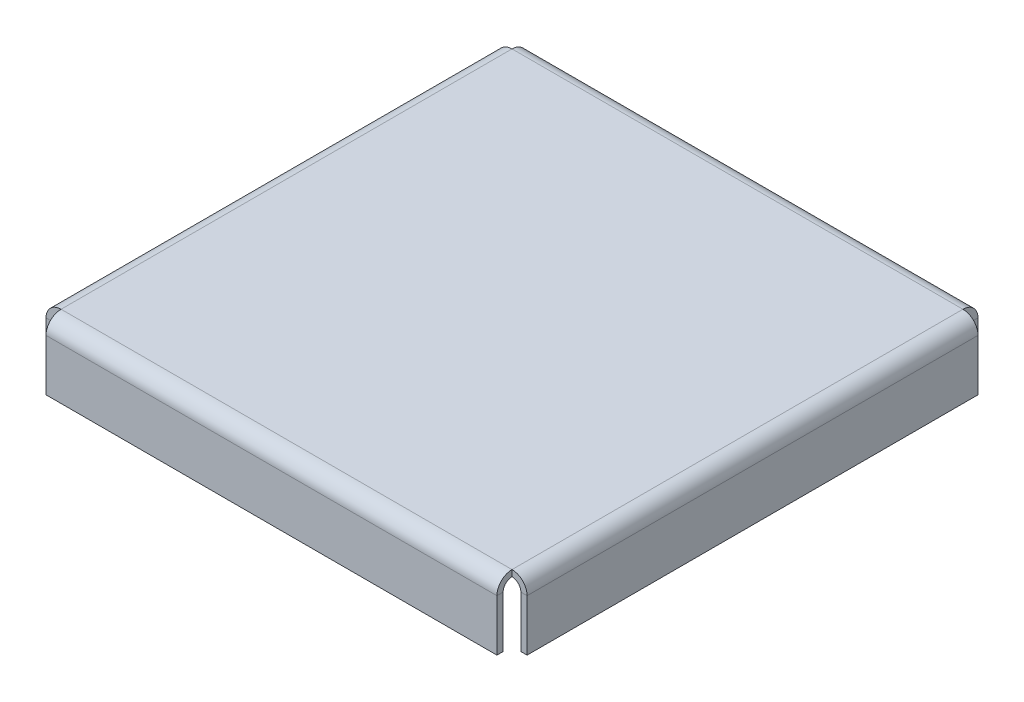
ISO-10303-21;
HEADER;
FILE_DESCRIPTION(('STEP AP214'),'2;1');
FILE_NAME('part.step','',(''),(''),'','','');
FILE_SCHEMA(('AUTOMOTIVE_DESIGN { 1 0 10303 214 1 1 1 1 }'));
ENDSEC;
DATA;
#1=APPLICATION_CONTEXT('core data for automotive mechanical design processes');
#2=APPLICATION_PROTOCOL_DEFINITION('international standard','automotive_design',2000,#1);
#3=PRODUCT_CONTEXT('',#1,'mechanical');
#4=PRODUCT('Part','Part','',(#3));
#5=PRODUCT_RELATED_PRODUCT_CATEGORY('part','',(#4));
#6=PRODUCT_DEFINITION_FORMATION('','',#4);
#7=PRODUCT_DEFINITION_CONTEXT('part definition',#1,'design');
#8=PRODUCT_DEFINITION('design','',#6,#7);
#9=PRODUCT_DEFINITION_SHAPE('','',#8);
#10=(LENGTH_UNIT() NAMED_UNIT(*) SI_UNIT(.MILLI.,.METRE.));
#11=(NAMED_UNIT(*) PLANE_ANGLE_UNIT() SI_UNIT($,.RADIAN.));
#12=(NAMED_UNIT(*) SI_UNIT($,.STERADIAN.) SOLID_ANGLE_UNIT());
#13=UNCERTAINTY_MEASURE_WITH_UNIT(LENGTH_MEASURE(1.E-05),#10,'distance_accuracy_value','');
#14=(GEOMETRIC_REPRESENTATION_CONTEXT(3) GLOBAL_UNCERTAINTY_ASSIGNED_CONTEXT((#13)) GLOBAL_UNIT_ASSIGNED_CONTEXT((#10,
#11,#12)) REPRESENTATION_CONTEXT('',''));
#15=CARTESIAN_POINT('',(0.,0.,0.));
#16=DIRECTION('',(0.,0.,1.));
#17=DIRECTION('',(1.,0.,0.));
#18=AXIS2_PLACEMENT_3D('',#15,#16,#17);
#19=CARTESIAN_POINT('',(0.,-0.7,0.));
#20=DIRECTION('',(0.,-1.,0.));
#21=DIRECTION('',(0.,0.,-1.));
#22=AXIS2_PLACEMENT_3D('',#19,#20,#21);
#23=PLANE('',#22);
#24=DIRECTION('',(0.,0.,-1.));
#25=VECTOR('',#24,1.);
#26=CARTESIAN_POINT('',(25.4,-0.7,25.4));
#27=LINE('',#26,#25);
#28=CARTESIAN_POINT('',(25.4,-0.699999999999996,25.4));
#29=VERTEX_POINT('',#28);
#30=CARTESIAN_POINT('',(25.4,-0.700000000000002,-25.4));
#31=VERTEX_POINT('',#30);
#32=EDGE_CURVE('E453',#29,#31,#27,.T.);
#33=ORIENTED_EDGE('',*,*,#32,.F.);
#34=DIRECTION('',(1.,0.,0.));
#35=VECTOR('',#34,1.);
#36=CARTESIAN_POINT('',(-25.4,-0.7,25.4));
#37=LINE('',#36,#35);
#38=CARTESIAN_POINT('',(-25.4,-0.699999999999997,25.4));
#39=VERTEX_POINT('',#38);
#40=EDGE_CURVE('E461',#39,#29,#37,.T.);
#41=ORIENTED_EDGE('',*,*,#40,.F.);
#42=DIRECTION('',(0.,0.,1.));
#43=VECTOR('',#42,1.);
#44=CARTESIAN_POINT('',(-25.4,-0.7,25.4));
#45=LINE('',#44,#43);
#46=CARTESIAN_POINT('',(-25.4,-0.700000000000007,-25.4));
#47=VERTEX_POINT('',#46);
#48=EDGE_CURVE('E459',#47,#39,#45,.T.);
#49=ORIENTED_EDGE('',*,*,#48,.F.);
#50=DIRECTION('',(-1.,0.,0.));
#51=VECTOR('',#50,1.);
#52=CARTESIAN_POINT('',(-25.4,-0.7,-25.4));
#53=LINE('',#52,#51);
#54=EDGE_CURVE('E456',#31,#47,#53,.T.);
#55=ORIENTED_EDGE('',*,*,#54,.F.);
#56=EDGE_LOOP('',(#33,#41,#49,#55));
#57=FACE_BOUND('',#56,.T.);
#58=ADVANCED_FACE('F117',(#57),#23,.T.);
#59=CARTESIAN_POINT('',(0.,0.,0.));
#60=DIRECTION('',(0.,-1.,0.));
#61=DIRECTION('',(0.,0.,-1.));
#62=AXIS2_PLACEMENT_3D('',#59,#60,#61);
#63=PLANE('',#62);
#64=DIRECTION('',(0.,0.,-1.));
#65=VECTOR('',#64,1.);
#66=CARTESIAN_POINT('',(25.4,0.,25.4));
#67=LINE('',#66,#65);
#68=CARTESIAN_POINT('',(25.4,0.,25.4));
#69=VERTEX_POINT('',#68);
#70=CARTESIAN_POINT('',(25.4,0.,-25.4));
#71=VERTEX_POINT('',#70);
#72=EDGE_CURVE('E447',#69,#71,#67,.T.);
#73=ORIENTED_EDGE('',*,*,#72,.T.);
#74=DIRECTION('',(-1.,0.,0.));
#75=VECTOR('',#74,1.);
#76=CARTESIAN_POINT('',(-25.4,0.,-25.4));
#77=LINE('',#76,#75);
#78=CARTESIAN_POINT('',(-25.4,0.,-25.4));
#79=VERTEX_POINT('',#78);
#80=EDGE_CURVE('E277',#71,#79,#77,.T.);
#81=ORIENTED_EDGE('',*,*,#80,.T.);
#82=DIRECTION('',(0.,0.,1.));
#83=VECTOR('',#82,1.);
#84=CARTESIAN_POINT('',(-25.4,0.,25.4));
#85=LINE('',#84,#83);
#86=CARTESIAN_POINT('',(-25.4,0.,25.4));
#87=VERTEX_POINT('',#86);
#88=EDGE_CURVE('E466',#79,#87,#85,.T.);
#89=ORIENTED_EDGE('',*,*,#88,.T.);
#90=DIRECTION('',(1.,0.,0.));
#91=VECTOR('',#90,1.);
#92=CARTESIAN_POINT('',(-25.4,0.,25.4));
#93=LINE('',#92,#91);
#94=EDGE_CURVE('E457',#87,#69,#93,.T.);
#95=ORIENTED_EDGE('',*,*,#94,.T.);
#96=EDGE_LOOP('',(#73,#81,#89,#95));
#97=FACE_BOUND('',#96,.T.);
#98=ADVANCED_FACE('F119',(#97),#63,.F.);
#99=CARTESIAN_POINT('',(25.4,-1.7,-25.4));
#100=DIRECTION('',(0.,0.,-1.));
#101=DIRECTION('',(-1.,0.,0.));
#102=AXIS2_PLACEMENT_3D('',#99,#100,#101);
#103=PLANE('',#102);
#104=DIRECTION('',(-1.,0.,0.));
#105=VECTOR('',#104,1.);
#106=CARTESIAN_POINT('',(27.1,-1.69999999999999,-25.4));
#107=LINE('',#106,#105);
#108=CARTESIAN_POINT('',(26.4,-1.7,-25.4));
#109=VERTEX_POINT('',#108);
#110=CARTESIAN_POINT('',(27.1,-1.69999999999999,-25.4));
#111=VERTEX_POINT('',#110);
#112=EDGE_CURVE('E147',#109,#111,#107,.F.);
#113=ORIENTED_EDGE('',*,*,#112,.F.);
#114=CARTESIAN_POINT('',(25.4,-1.7,-25.4));
#115=DIRECTION('',(0.,0.,1.));
#116=DIRECTION('',(1.,0.,0.));
#117=AXIS2_PLACEMENT_3D('',#114,#115,#116);
#118=CIRCLE('',#117,1.);
#119=EDGE_CURVE('E449',#31,#109,#118,.F.);
#120=ORIENTED_EDGE('',*,*,#119,.F.);
#121=DIRECTION('',(0.,1.,0.));
#122=VECTOR('',#121,1.);
#123=CARTESIAN_POINT('',(25.4,-0.7,-25.4));
#124=LINE('',#123,#122);
#125=EDGE_CURVE('E121',#31,#71,#124,.T.);
#126=ORIENTED_EDGE('',*,*,#125,.T.);
#127=CARTESIAN_POINT('',(25.4,-1.7,-25.4));
#128=DIRECTION('',(0.,0.,1.));
#129=DIRECTION('',(1.,0.,0.));
#130=AXIS2_PLACEMENT_3D('',#127,#128,#129);
#131=CIRCLE('',#130,1.7);
#132=EDGE_CURVE('E445',#71,#111,#131,.F.);
#133=ORIENTED_EDGE('',*,*,#132,.T.);
#134=EDGE_LOOP('',(#113,#120,#126,#133));
#135=FACE_BOUND('',#134,.T.);
#136=ADVANCED_FACE('F474',(#135),#103,.T.);
#137=CARTESIAN_POINT('',(25.4,-1.7,25.4));
#138=DIRECTION('',(0.,0.,-1.));
#139=DIRECTION('',(-1.,0.,0.));
#140=AXIS2_PLACEMENT_3D('',#137,#138,#139);
#141=PLANE('',#140);
#142=CARTESIAN_POINT('',(25.4,-1.7,25.4));
#143=DIRECTION('',(0.,0.,1.));
#144=DIRECTION('',(1.,0.,0.));
#145=AXIS2_PLACEMENT_3D('',#142,#143,#144);
#146=CIRCLE('',#145,1.);
#147=CARTESIAN_POINT('',(26.4,-1.7,25.4));
#148=VERTEX_POINT('',#147);
#149=EDGE_CURVE('E422',#148,#29,#146,.T.);
#150=ORIENTED_EDGE('',*,*,#149,.F.);
#151=DIRECTION('',(-1.,0.,0.));
#152=VECTOR('',#151,1.);
#153=CARTESIAN_POINT('',(26.4,-1.7,25.4));
#154=LINE('',#153,#152);
#155=CARTESIAN_POINT('',(27.1,-1.69999999999999,25.4));
#156=VERTEX_POINT('',#155);
#157=EDGE_CURVE('E440',#148,#156,#154,.F.);
#158=ORIENTED_EDGE('',*,*,#157,.T.);
#159=CARTESIAN_POINT('',(25.4,-1.7,25.4));
#160=DIRECTION('',(0.,0.,1.));
#161=DIRECTION('',(1.,0.,0.));
#162=AXIS2_PLACEMENT_3D('',#159,#160,#161);
#163=CIRCLE('',#162,1.7);
#164=EDGE_CURVE('E175',#156,#69,#163,.T.);
#165=ORIENTED_EDGE('',*,*,#164,.T.);
#166=DIRECTION('',(0.,1.,0.));
#167=VECTOR('',#166,1.);
#168=CARTESIAN_POINT('',(25.4,-0.7,25.4));
#169=LINE('',#168,#167);
#170=EDGE_CURVE('E13',#29,#69,#169,.T.);
#171=ORIENTED_EDGE('',*,*,#170,.F.);
#172=EDGE_LOOP('',(#150,#158,#165,#171));
#173=FACE_BOUND('',#172,.T.);
#174=ADVANCED_FACE('F484',(#173),#141,.F.);
#175=CARTESIAN_POINT('',(25.4,-1.7,25.4));
#176=DIRECTION('',(0.,0.,1.));
#177=DIRECTION('',(1.,0.,0.));
#178=AXIS2_PLACEMENT_3D('',#175,#176,#177);
#179=CYLINDRICAL_SURFACE('',#178,1.7);
#180=ORIENTED_EDGE('',*,*,#72,.F.);
#181=ORIENTED_EDGE('',*,*,#164,.F.);
#182=DIRECTION('',(0.,0.,1.));
#183=VECTOR('',#182,1.);
#184=CARTESIAN_POINT('',(27.1,-1.69999999999999,-25.4));
#185=LINE('',#184,#183);
#186=EDGE_CURVE('E438',#156,#111,#185,.F.);
#187=ORIENTED_EDGE('',*,*,#186,.T.);
#188=ORIENTED_EDGE('',*,*,#132,.F.);
#189=EDGE_LOOP('',(#180,#181,#187,#188));
#190=FACE_BOUND('',#189,.T.);
#191=ADVANCED_FACE('F480',(#190),#179,.T.);
#192=CARTESIAN_POINT('',(25.4,-1.7,25.4));
#193=DIRECTION('',(0.,0.,1.));
#194=DIRECTION('',(1.,0.,0.));
#195=AXIS2_PLACEMENT_3D('',#192,#193,#194);
#196=CYLINDRICAL_SURFACE('',#195,1.);
#197=ORIENTED_EDGE('',*,*,#32,.T.);
#198=ORIENTED_EDGE('',*,*,#119,.T.);
#199=DIRECTION('',(0.,0.,1.));
#200=VECTOR('',#199,1.);
#201=CARTESIAN_POINT('',(26.4,-1.7,-25.4));
#202=LINE('',#201,#200);
#203=EDGE_CURVE('E442',#109,#148,#202,.T.);
#204=ORIENTED_EDGE('',*,*,#203,.T.);
#205=ORIENTED_EDGE('',*,*,#149,.T.);
#206=EDGE_LOOP('',(#197,#198,#204,#205));
#207=FACE_BOUND('',#206,.T.);
#208=ADVANCED_FACE('F504',(#207),#196,.F.);
#209=CARTESIAN_POINT('',(27.1,-7.5,25.4));
#210=DIRECTION('',(0.,0.,-1.));
#211=DIRECTION('',(-1.,0.,0.));
#212=AXIS2_PLACEMENT_3D('',#209,#210,#211);
#213=PLANE('',#212);
#214=ORIENTED_EDGE('',*,*,#157,.F.);
#215=DIRECTION('',(0.,1.,0.));
#216=VECTOR('',#215,1.);
#217=CARTESIAN_POINT('',(26.4,-7.5,25.4));
#218=LINE('',#217,#216);
#219=CARTESIAN_POINT('',(26.4,-7.5,25.4));
#220=VERTEX_POINT('',#219);
#221=EDGE_CURVE('E436',#148,#220,#218,.F.);
#222=ORIENTED_EDGE('',*,*,#221,.T.);
#223=DIRECTION('',(-1.,0.,0.));
#224=VECTOR('',#223,1.);
#225=CARTESIAN_POINT('',(27.1,-7.5,25.4));
#226=LINE('',#225,#224);
#227=CARTESIAN_POINT('',(27.1,-7.5,25.4));
#228=VERTEX_POINT('',#227);
#229=EDGE_CURVE('E419',#228,#220,#226,.T.);
#230=ORIENTED_EDGE('',*,*,#229,.F.);
#231=DIRECTION('',(0.,-1.,0.));
#232=VECTOR('',#231,1.);
#233=CARTESIAN_POINT('',(27.1,0.,25.4));
#234=LINE('',#233,#232);
#235=EDGE_CURVE('E429',#156,#228,#234,.T.);
#236=ORIENTED_EDGE('',*,*,#235,.F.);
#237=EDGE_LOOP('',(#214,#222,#230,#236));
#238=FACE_BOUND('',#237,.T.);
#239=ADVANCED_FACE('F493',(#238),#213,.F.);
#240=CARTESIAN_POINT('',(27.1,-0.699999999999998,-25.4));
#241=DIRECTION('',(0.,0.,1.));
#242=DIRECTION('',(1.,0.,0.));
#243=AXIS2_PLACEMENT_3D('',#240,#241,#242);
#244=PLANE('',#243);
#245=ORIENTED_EDGE('',*,*,#112,.T.);
#246=DIRECTION('',(0.,1.,0.));
#247=VECTOR('',#246,1.);
#248=CARTESIAN_POINT('',(27.1,0.,-25.4));
#249=LINE('',#248,#247);
#250=CARTESIAN_POINT('',(27.1,-7.5,-25.4));
#251=VERTEX_POINT('',#250);
#252=EDGE_CURVE('E426',#251,#111,#249,.T.);
#253=ORIENTED_EDGE('',*,*,#252,.F.);
#254=DIRECTION('',(-1.,0.,0.));
#255=VECTOR('',#254,1.);
#256=CARTESIAN_POINT('',(27.1,-7.5,-25.4));
#257=LINE('',#256,#255);
#258=CARTESIAN_POINT('',(26.4,-7.5,-25.4));
#259=VERTEX_POINT('',#258);
#260=EDGE_CURVE('E423',#251,#259,#257,.T.);
#261=ORIENTED_EDGE('',*,*,#260,.T.);
#262=DIRECTION('',(0.,-1.,0.));
#263=VECTOR('',#262,1.);
#264=CARTESIAN_POINT('',(26.4,-0.7,-25.4));
#265=LINE('',#264,#263);
#266=EDGE_CURVE('E431',#259,#109,#265,.F.);
#267=ORIENTED_EDGE('',*,*,#266,.T.);
#268=EDGE_LOOP('',(#245,#253,#261,#267));
#269=FACE_BOUND('',#268,.T.);
#270=ADVANCED_FACE('F499',(#269),#244,.F.);
#271=CARTESIAN_POINT('',(27.1,0.,0.));
#272=DIRECTION('',(-1.,0.,0.));
#273=DIRECTION('',(0.,-1.,0.));
#274=AXIS2_PLACEMENT_3D('',#271,#272,#273);
#275=PLANE('',#274);
#276=ORIENTED_EDGE('',*,*,#186,.F.);
#277=ORIENTED_EDGE('',*,*,#235,.T.);
#278=DIRECTION('',(0.,0.,-1.));
#279=VECTOR('',#278,1.);
#280=CARTESIAN_POINT('',(27.1,-7.5,0.));
#281=LINE('',#280,#279);
#282=EDGE_CURVE('E157',#228,#251,#281,.T.);
#283=ORIENTED_EDGE('',*,*,#282,.T.);
#284=ORIENTED_EDGE('',*,*,#252,.T.);
#285=EDGE_LOOP('',(#276,#277,#283,#284));
#286=FACE_BOUND('',#285,.T.);
#287=ADVANCED_FACE('F490',(#286),#275,.F.);
#288=CARTESIAN_POINT('',(26.4,0.,0.));
#289=DIRECTION('',(-1.,0.,0.));
#290=DIRECTION('',(0.,-1.,0.));
#291=AXIS2_PLACEMENT_3D('',#288,#289,#290);
#292=PLANE('',#291);
#293=ORIENTED_EDGE('',*,*,#221,.F.);
#294=ORIENTED_EDGE('',*,*,#203,.F.);
#295=ORIENTED_EDGE('',*,*,#266,.F.);
#296=DIRECTION('',(0.,0.,1.));
#297=VECTOR('',#296,1.);
#298=CARTESIAN_POINT('',(26.4,-7.5,-25.4));
#299=LINE('',#298,#297);
#300=EDGE_CURVE('E434',#220,#259,#299,.F.);
#301=ORIENTED_EDGE('',*,*,#300,.F.);
#302=EDGE_LOOP('',(#293,#294,#295,#301));
#303=FACE_BOUND('',#302,.T.);
#304=ADVANCED_FACE('F502',(#303),#292,.T.);
#305=CARTESIAN_POINT('',(27.1,-7.5,-25.4));
#306=DIRECTION('',(0.,1.,0.));
#307=DIRECTION('',(-1.,0.,0.));
#308=AXIS2_PLACEMENT_3D('',#305,#306,#307);
#309=PLANE('',#308);
#310=ORIENTED_EDGE('',*,*,#300,.T.);
#311=ORIENTED_EDGE('',*,*,#260,.F.);
#312=ORIENTED_EDGE('',*,*,#282,.F.);
#313=ORIENTED_EDGE('',*,*,#229,.T.);
#314=EDGE_LOOP('',(#310,#311,#312,#313));
#315=FACE_BOUND('',#314,.T.);
#316=ADVANCED_FACE('F496',(#315),#309,.F.);
#317=CARTESIAN_POINT('',(25.4,-1.7,25.4));
#318=DIRECTION('',(1.,0.,0.));
#319=DIRECTION('',(0.,0.,-1.));
#320=AXIS2_PLACEMENT_3D('',#317,#318,#319);
#321=PLANE('',#320);
#322=DIRECTION('',(0.,0.,-1.));
#323=VECTOR('',#322,1.);
#324=CARTESIAN_POINT('',(25.4,-1.7,27.1));
#325=LINE('',#324,#323);
#326=CARTESIAN_POINT('',(25.4,-1.69999999999999,26.4));
#327=VERTEX_POINT('',#326);
#328=CARTESIAN_POINT('',(25.4,-1.69999999999999,27.1));
#329=VERTEX_POINT('',#328);
#330=EDGE_CURVE('E197',#327,#329,#325,.F.);
#331=ORIENTED_EDGE('',*,*,#330,.F.);
#332=CARTESIAN_POINT('',(25.4,-1.7,25.4));
#333=DIRECTION('',(-1.,0.,0.));
#334=DIRECTION('',(0.,0.,1.));
#335=AXIS2_PLACEMENT_3D('',#332,#333,#334);
#336=CIRCLE('',#335,1.);
#337=EDGE_CURVE('E415',#29,#327,#336,.F.);
#338=ORIENTED_EDGE('',*,*,#337,.F.);
#339=ORIENTED_EDGE('',*,*,#170,.T.);
#340=CARTESIAN_POINT('',(25.4,-1.7,25.4));
#341=DIRECTION('',(-1.,0.,0.));
#342=DIRECTION('',(0.,0.,1.));
#343=AXIS2_PLACEMENT_3D('',#340,#341,#342);
#344=CIRCLE('',#343,1.7);
#345=EDGE_CURVE('E136',#69,#329,#344,.F.);
#346=ORIENTED_EDGE('',*,*,#345,.T.);
#347=EDGE_LOOP('',(#331,#338,#339,#346));
#348=FACE_BOUND('',#347,.T.);
#349=ADVANCED_FACE('F562',(#348),#321,.T.);
#350=CARTESIAN_POINT('',(-25.4,-1.7,25.4));
#351=DIRECTION('',(1.,0.,0.));
#352=DIRECTION('',(0.,0.,-1.));
#353=AXIS2_PLACEMENT_3D('',#350,#351,#352);
#354=PLANE('',#353);
#355=CARTESIAN_POINT('',(-25.4,-1.7,25.4));
#356=DIRECTION('',(-1.,0.,0.));
#357=DIRECTION('',(0.,0.,1.));
#358=AXIS2_PLACEMENT_3D('',#355,#356,#357);
#359=CIRCLE('',#358,1.);
#360=CARTESIAN_POINT('',(-25.4,-1.69999999999999,26.4));
#361=VERTEX_POINT('',#360);
#362=EDGE_CURVE('E390',#361,#39,#359,.T.);
#363=ORIENTED_EDGE('',*,*,#362,.F.);
#364=DIRECTION('',(0.,0.,-1.));
#365=VECTOR('',#364,1.);
#366=CARTESIAN_POINT('',(-25.4,-1.7,26.4));
#367=LINE('',#366,#365);
#368=CARTESIAN_POINT('',(-25.4,-1.7,27.1));
#369=VERTEX_POINT('',#368);
#370=EDGE_CURVE('E408',#361,#369,#367,.F.);
#371=ORIENTED_EDGE('',*,*,#370,.T.);
#372=CARTESIAN_POINT('',(-25.4,-1.7,25.4));
#373=DIRECTION('',(-1.,0.,0.));
#374=DIRECTION('',(0.,0.,1.));
#375=AXIS2_PLACEMENT_3D('',#372,#373,#374);
#376=CIRCLE('',#375,1.7);
#377=EDGE_CURVE('E223',#369,#87,#376,.T.);
#378=ORIENTED_EDGE('',*,*,#377,.T.);
#379=DIRECTION('',(0.,1.,0.));
#380=VECTOR('',#379,1.);
#381=CARTESIAN_POINT('',(-25.4,-0.7,25.4));
#382=LINE('',#381,#380);
#383=EDGE_CURVE('E127',#39,#87,#382,.T.);
#384=ORIENTED_EDGE('',*,*,#383,.F.);
#385=EDGE_LOOP('',(#363,#371,#378,#384));
#386=FACE_BOUND('',#385,.T.);
#387=ADVANCED_FACE('F541',(#386),#354,.F.);
#388=CARTESIAN_POINT('',(-25.4,-1.7,25.4));
#389=DIRECTION('',(-1.,0.,0.));
#390=DIRECTION('',(0.,0.,1.));
#391=AXIS2_PLACEMENT_3D('',#388,#389,#390);
#392=CYLINDRICAL_SURFACE('',#391,1.7);
#393=ORIENTED_EDGE('',*,*,#94,.F.);
#394=ORIENTED_EDGE('',*,*,#377,.F.);
#395=DIRECTION('',(-1.,0.,0.));
#396=VECTOR('',#395,1.);
#397=CARTESIAN_POINT('',(25.4,-1.7,27.1));
#398=LINE('',#397,#396);
#399=EDGE_CURVE('E406',#369,#329,#398,.F.);
#400=ORIENTED_EDGE('',*,*,#399,.T.);
#401=ORIENTED_EDGE('',*,*,#345,.F.);
#402=EDGE_LOOP('',(#393,#394,#400,#401));
#403=FACE_BOUND('',#402,.T.);
#404=ADVANCED_FACE('F540',(#403),#392,.T.);
#405=CARTESIAN_POINT('',(-25.4,-1.7,25.4));
#406=DIRECTION('',(-1.,0.,0.));
#407=DIRECTION('',(0.,0.,1.));
#408=AXIS2_PLACEMENT_3D('',#405,#406,#407);
#409=CYLINDRICAL_SURFACE('',#408,1.);
#410=ORIENTED_EDGE('',*,*,#40,.T.);
#411=ORIENTED_EDGE('',*,*,#337,.T.);
#412=DIRECTION('',(-1.,0.,0.));
#413=VECTOR('',#412,1.);
#414=CARTESIAN_POINT('',(25.4,-1.7,26.4));
#415=LINE('',#414,#413);
#416=EDGE_CURVE('E410',#327,#361,#415,.T.);
#417=ORIENTED_EDGE('',*,*,#416,.T.);
#418=ORIENTED_EDGE('',*,*,#362,.T.);
#419=EDGE_LOOP('',(#410,#411,#417,#418));
#420=FACE_BOUND('',#419,.T.);
#421=ADVANCED_FACE('F561',(#420),#409,.F.);
#422=CARTESIAN_POINT('',(-25.4,-7.5,27.1));
#423=DIRECTION('',(1.,0.,0.));
#424=DIRECTION('',(0.,0.,-1.));
#425=AXIS2_PLACEMENT_3D('',#422,#423,#424);
#426=PLANE('',#425);
#427=ORIENTED_EDGE('',*,*,#370,.F.);
#428=DIRECTION('',(0.,1.,0.));
#429=VECTOR('',#428,1.);
#430=CARTESIAN_POINT('',(-25.4,-7.5,26.4));
#431=LINE('',#430,#429);
#432=CARTESIAN_POINT('',(-25.4,-7.5,26.4));
#433=VERTEX_POINT('',#432);
#434=EDGE_CURVE('E404',#361,#433,#431,.F.);
#435=ORIENTED_EDGE('',*,*,#434,.T.);
#436=DIRECTION('',(0.,0.,-1.));
#437=VECTOR('',#436,1.);
#438=CARTESIAN_POINT('',(-25.4,-7.5,27.1));
#439=LINE('',#438,#437);
#440=CARTESIAN_POINT('',(-25.4,-7.5,27.1));
#441=VERTEX_POINT('',#440);
#442=EDGE_CURVE('E387',#441,#433,#439,.T.);
#443=ORIENTED_EDGE('',*,*,#442,.F.);
#444=DIRECTION('',(0.,-1.,0.));
#445=VECTOR('',#444,1.);
#446=CARTESIAN_POINT('',(-25.4,0.,27.1));
#447=LINE('',#446,#445);
#448=EDGE_CURVE('E397',#369,#441,#447,.T.);
#449=ORIENTED_EDGE('',*,*,#448,.F.);
#450=EDGE_LOOP('',(#427,#435,#443,#449));
#451=FACE_BOUND('',#450,.T.);
#452=ADVANCED_FACE('F550',(#451),#426,.F.);
#453=CARTESIAN_POINT('',(25.4,-0.699999999999997,27.1));
#454=DIRECTION('',(-1.,0.,0.));
#455=DIRECTION('',(0.,0.,1.));
#456=AXIS2_PLACEMENT_3D('',#453,#454,#455);
#457=PLANE('',#456);
#458=ORIENTED_EDGE('',*,*,#330,.T.);
#459=DIRECTION('',(0.,1.,0.));
#460=VECTOR('',#459,1.);
#461=CARTESIAN_POINT('',(25.4,0.,27.1));
#462=LINE('',#461,#460);
#463=CARTESIAN_POINT('',(25.4,-7.5,27.1));
#464=VERTEX_POINT('',#463);
#465=EDGE_CURVE('E394',#464,#329,#462,.T.);
#466=ORIENTED_EDGE('',*,*,#465,.F.);
#467=DIRECTION('',(0.,0.,-1.));
#468=VECTOR('',#467,1.);
#469=CARTESIAN_POINT('',(25.4,-7.5,27.1));
#470=LINE('',#469,#468);
#471=CARTESIAN_POINT('',(25.4,-7.5,26.4));
#472=VERTEX_POINT('',#471);
#473=EDGE_CURVE('E391',#464,#472,#470,.T.);
#474=ORIENTED_EDGE('',*,*,#473,.T.);
#475=DIRECTION('',(0.,-1.,0.));
#476=VECTOR('',#475,1.);
#477=CARTESIAN_POINT('',(25.4,-0.699999999999999,26.4));
#478=LINE('',#477,#476);
#479=EDGE_CURVE('E399',#472,#327,#478,.F.);
#480=ORIENTED_EDGE('',*,*,#479,.T.);
#481=EDGE_LOOP('',(#458,#466,#474,#480));
#482=FACE_BOUND('',#481,.T.);
#483=ADVANCED_FACE('F556',(#482),#457,.F.);
#484=CARTESIAN_POINT('',(0.,0.,27.1));
#485=DIRECTION('',(0.,0.,-1.));
#486=DIRECTION('',(0.,1.,0.));
#487=AXIS2_PLACEMENT_3D('',#484,#485,#486);
#488=PLANE('',#487);
#489=ORIENTED_EDGE('',*,*,#399,.F.);
#490=ORIENTED_EDGE('',*,*,#448,.T.);
#491=DIRECTION('',(1.,0.,0.));
#492=VECTOR('',#491,1.);
#493=CARTESIAN_POINT('',(0.,-7.5,27.1));
#494=LINE('',#493,#492);
#495=EDGE_CURVE('E207',#441,#464,#494,.T.);
#496=ORIENTED_EDGE('',*,*,#495,.T.);
#497=ORIENTED_EDGE('',*,*,#465,.T.);
#498=EDGE_LOOP('',(#489,#490,#496,#497));
#499=FACE_BOUND('',#498,.T.);
#500=ADVANCED_FACE('F547',(#499),#488,.F.);
#501=CARTESIAN_POINT('',(0.,0.,26.4));
#502=DIRECTION('',(0.,0.,-1.));
#503=DIRECTION('',(0.,1.,0.));
#504=AXIS2_PLACEMENT_3D('',#501,#502,#503);
#505=PLANE('',#504);
#506=ORIENTED_EDGE('',*,*,#434,.F.);
#507=ORIENTED_EDGE('',*,*,#416,.F.);
#508=ORIENTED_EDGE('',*,*,#479,.F.);
#509=DIRECTION('',(-1.,0.,0.));
#510=VECTOR('',#509,1.);
#511=CARTESIAN_POINT('',(25.4,-7.5,26.4));
#512=LINE('',#511,#510);
#513=EDGE_CURVE('E402',#433,#472,#512,.F.);
#514=ORIENTED_EDGE('',*,*,#513,.F.);
#515=EDGE_LOOP('',(#506,#507,#508,#514));
#516=FACE_BOUND('',#515,.T.);
#517=ADVANCED_FACE('F559',(#516),#505,.T.);
#518=CARTESIAN_POINT('',(25.4,-7.5,27.1));
#519=DIRECTION('',(0.,1.,0.));
#520=DIRECTION('',(0.,0.,1.));
#521=AXIS2_PLACEMENT_3D('',#518,#519,#520);
#522=PLANE('',#521);
#523=ORIENTED_EDGE('',*,*,#513,.T.);
#524=ORIENTED_EDGE('',*,*,#473,.F.);
#525=ORIENTED_EDGE('',*,*,#495,.F.);
#526=ORIENTED_EDGE('',*,*,#442,.T.);
#527=EDGE_LOOP('',(#523,#524,#525,#526));
#528=FACE_BOUND('',#527,.T.);
#529=ADVANCED_FACE('F553',(#528),#522,.F.);
#530=CARTESIAN_POINT('',(-25.4,-1.7,25.4));
#531=DIRECTION('',(0.,0.,1.));
#532=DIRECTION('',(0.,-1.,0.));
#533=AXIS2_PLACEMENT_3D('',#530,#531,#532);
#534=PLANE('',#533);
#535=DIRECTION('',(1.,0.,0.));
#536=VECTOR('',#535,1.);
#537=CARTESIAN_POINT('',(-27.1,-1.69999999999999,25.4));
#538=LINE('',#537,#536);
#539=CARTESIAN_POINT('',(-26.4,-1.69999999999999,25.4));
#540=VERTEX_POINT('',#539);
#541=CARTESIAN_POINT('',(-27.1,-1.69999999999999,25.4));
#542=VERTEX_POINT('',#541);
#543=EDGE_CURVE('E245',#540,#542,#538,.F.);
#544=ORIENTED_EDGE('',*,*,#543,.F.);
#545=CARTESIAN_POINT('',(-25.4,-1.7,25.4));
#546=DIRECTION('',(0.,0.,-1.));
#547=DIRECTION('',(0.,1.,0.));
#548=AXIS2_PLACEMENT_3D('',#545,#546,#547);
#549=CIRCLE('',#548,1.);
#550=EDGE_CURVE('E383',#39,#540,#549,.F.);
#551=ORIENTED_EDGE('',*,*,#550,.F.);
#552=ORIENTED_EDGE('',*,*,#383,.T.);
#553=CARTESIAN_POINT('',(-25.4,-1.7,25.4));
#554=DIRECTION('',(0.,0.,-1.));
#555=DIRECTION('',(0.,1.,0.));
#556=AXIS2_PLACEMENT_3D('',#553,#554,#555);
#557=CIRCLE('',#556,1.7);
#558=EDGE_CURVE('E184',#87,#542,#557,.F.);
#559=ORIENTED_EDGE('',*,*,#558,.T.);
#560=EDGE_LOOP('',(#544,#551,#552,#559));
#561=FACE_BOUND('',#560,.T.);
#562=ADVANCED_FACE('F536',(#561),#534,.T.);
#563=CARTESIAN_POINT('',(-25.4,-1.7,-25.4));
#564=DIRECTION('',(0.,0.,1.));
#565=DIRECTION('',(0.,-1.,0.));
#566=AXIS2_PLACEMENT_3D('',#563,#564,#565);
#567=PLANE('',#566);
#568=CARTESIAN_POINT('',(-25.4,-1.7,-25.4));
#569=DIRECTION('',(0.,0.,-1.));
#570=DIRECTION('',(0.,1.,0.));
#571=AXIS2_PLACEMENT_3D('',#568,#569,#570);
#572=CIRCLE('',#571,1.);
#573=CARTESIAN_POINT('',(-26.4,-1.7,-25.4));
#574=VERTEX_POINT('',#573);
#575=EDGE_CURVE('E358',#574,#47,#572,.T.);
#576=ORIENTED_EDGE('',*,*,#575,.F.);
#577=DIRECTION('',(1.,0.,0.));
#578=VECTOR('',#577,1.);
#579=CARTESIAN_POINT('',(-26.4,-1.7,-25.4));
#580=LINE('',#579,#578);
#581=CARTESIAN_POINT('',(-27.1,-1.7,-25.4));
#582=VERTEX_POINT('',#581);
#583=EDGE_CURVE('E376',#574,#582,#580,.F.);
#584=ORIENTED_EDGE('',*,*,#583,.T.);
#585=CARTESIAN_POINT('',(-25.4,-1.7,-25.4));
#586=DIRECTION('',(0.,0.,-1.));
#587=DIRECTION('',(0.,1.,0.));
#588=AXIS2_PLACEMENT_3D('',#585,#586,#587);
#589=CIRCLE('',#588,1.7);
#590=EDGE_CURVE('E271',#582,#79,#589,.T.);
#591=ORIENTED_EDGE('',*,*,#590,.T.);
#592=DIRECTION('',(0.,1.,0.));
#593=VECTOR('',#592,1.);
#594=CARTESIAN_POINT('',(-25.4,-0.7,-25.4));
#595=LINE('',#594,#593);
#596=EDGE_CURVE('E471',#47,#79,#595,.T.);
#597=ORIENTED_EDGE('',*,*,#596,.F.);
#598=EDGE_LOOP('',(#576,#584,#591,#597));
#599=FACE_BOUND('',#598,.T.);
#600=ADVANCED_FACE('F514',(#599),#567,.F.);
#601=CARTESIAN_POINT('',(-25.4,-1.7,-25.4));
#602=DIRECTION('',(0.,0.,-1.));
#603=DIRECTION('',(-1.,0.,0.));
#604=AXIS2_PLACEMENT_3D('',#601,#602,#603);
#605=CYLINDRICAL_SURFACE('',#604,1.7);
#606=ORIENTED_EDGE('',*,*,#88,.F.);
#607=ORIENTED_EDGE('',*,*,#590,.F.);
#608=DIRECTION('',(0.,0.,-1.));
#609=VECTOR('',#608,1.);
#610=CARTESIAN_POINT('',(-27.1,-1.69999999999999,25.4));
#611=LINE('',#610,#609);
#612=EDGE_CURVE('E374',#582,#542,#611,.F.);
#613=ORIENTED_EDGE('',*,*,#612,.T.);
#614=ORIENTED_EDGE('',*,*,#558,.F.);
#615=EDGE_LOOP('',(#606,#607,#613,#614));
#616=FACE_BOUND('',#615,.T.);
#617=ADVANCED_FACE('F535',(#616),#605,.T.);
#618=CARTESIAN_POINT('',(-25.4,-1.7,-25.4));
#619=DIRECTION('',(0.,0.,-1.));
#620=DIRECTION('',(-1.,0.,0.));
#621=AXIS2_PLACEMENT_3D('',#618,#619,#620);
#622=CYLINDRICAL_SURFACE('',#621,1.);
#623=ORIENTED_EDGE('',*,*,#48,.T.);
#624=ORIENTED_EDGE('',*,*,#550,.T.);
#625=DIRECTION('',(0.,0.,-1.));
#626=VECTOR('',#625,1.);
#627=CARTESIAN_POINT('',(-26.4,-1.69999999999999,25.4));
#628=LINE('',#627,#626);
#629=EDGE_CURVE('E378',#540,#574,#628,.T.);
#630=ORIENTED_EDGE('',*,*,#629,.T.);
#631=ORIENTED_EDGE('',*,*,#575,.T.);
#632=EDGE_LOOP('',(#623,#624,#630,#631));
#633=FACE_BOUND('',#632,.T.);
#634=ADVANCED_FACE('F517',(#633),#622,.F.);
#635=CARTESIAN_POINT('',(-27.1,-7.5,-25.4));
#636=DIRECTION('',(0.,0.,1.));
#637=DIRECTION('',(1.,0.,0.));
#638=AXIS2_PLACEMENT_3D('',#635,#636,#637);
#639=PLANE('',#638);
#640=ORIENTED_EDGE('',*,*,#583,.F.);
#641=DIRECTION('',(0.,1.,0.));
#642=VECTOR('',#641,1.);
#643=CARTESIAN_POINT('',(-26.4,-7.5,-25.4));
#644=LINE('',#643,#642);
#645=CARTESIAN_POINT('',(-26.4,-7.5,-25.4));
#646=VERTEX_POINT('',#645);
#647=EDGE_CURVE('E372',#574,#646,#644,.F.);
#648=ORIENTED_EDGE('',*,*,#647,.T.);
#649=DIRECTION('',(1.,0.,0.));
#650=VECTOR('',#649,1.);
#651=CARTESIAN_POINT('',(-27.1,-7.5,-25.4));
#652=LINE('',#651,#650);
#653=CARTESIAN_POINT('',(-27.1,-7.5,-25.4));
#654=VERTEX_POINT('',#653);
#655=EDGE_CURVE('E355',#654,#646,#652,.T.);
#656=ORIENTED_EDGE('',*,*,#655,.F.);
#657=DIRECTION('',(0.,-1.,0.));
#658=VECTOR('',#657,1.);
#659=CARTESIAN_POINT('',(-27.1,0.,-25.4));
#660=LINE('',#659,#658);
#661=EDGE_CURVE('E365',#582,#654,#660,.T.);
#662=ORIENTED_EDGE('',*,*,#661,.F.);
#663=EDGE_LOOP('',(#640,#648,#656,#662));
#664=FACE_BOUND('',#663,.T.);
#665=ADVANCED_FACE('F532',(#664),#639,.F.);
#666=CARTESIAN_POINT('',(-27.1,-0.699999999999993,25.4));
#667=DIRECTION('',(0.,0.,-1.));
#668=DIRECTION('',(-1.,0.,0.));
#669=AXIS2_PLACEMENT_3D('',#666,#667,#668);
#670=PLANE('',#669);
#671=ORIENTED_EDGE('',*,*,#543,.T.);
#672=DIRECTION('',(0.,1.,0.));
#673=VECTOR('',#672,1.);
#674=CARTESIAN_POINT('',(-27.1,0.,25.4));
#675=LINE('',#674,#673);
#676=CARTESIAN_POINT('',(-27.1,-7.5,25.4));
#677=VERTEX_POINT('',#676);
#678=EDGE_CURVE('E362',#677,#542,#675,.T.);
#679=ORIENTED_EDGE('',*,*,#678,.F.);
#680=DIRECTION('',(1.,0.,0.));
#681=VECTOR('',#680,1.);
#682=CARTESIAN_POINT('',(-27.1,-7.5,25.4));
#683=LINE('',#682,#681);
#684=CARTESIAN_POINT('',(-26.4,-7.5,25.4));
#685=VERTEX_POINT('',#684);
#686=EDGE_CURVE('E359',#677,#685,#683,.T.);
#687=ORIENTED_EDGE('',*,*,#686,.T.);
#688=DIRECTION('',(0.,-1.,0.));
#689=VECTOR('',#688,1.);
#690=CARTESIAN_POINT('',(-26.4,-0.699999999999996,25.4));
#691=LINE('',#690,#689);
#692=EDGE_CURVE('E367',#685,#540,#691,.F.);
#693=ORIENTED_EDGE('',*,*,#692,.T.);
#694=EDGE_LOOP('',(#671,#679,#687,#693));
#695=FACE_BOUND('',#694,.T.);
#696=ADVANCED_FACE('F525',(#695),#670,.F.);
#697=CARTESIAN_POINT('',(-27.1,0.,0.));
#698=DIRECTION('',(1.,0.,0.));
#699=DIRECTION('',(0.,1.,0.));
#700=AXIS2_PLACEMENT_3D('',#697,#698,#699);
#701=PLANE('',#700);
#702=ORIENTED_EDGE('',*,*,#612,.F.);
#703=ORIENTED_EDGE('',*,*,#661,.T.);
#704=DIRECTION('',(0.,0.,1.));
#705=VECTOR('',#704,1.);
#706=CARTESIAN_POINT('',(-27.1,-7.5,0.));
#707=LINE('',#706,#705);
#708=EDGE_CURVE('E255',#654,#677,#707,.T.);
#709=ORIENTED_EDGE('',*,*,#708,.T.);
#710=ORIENTED_EDGE('',*,*,#678,.T.);
#711=EDGE_LOOP('',(#702,#703,#709,#710));
#712=FACE_BOUND('',#711,.T.);
#713=ADVANCED_FACE('F534',(#712),#701,.F.);
#714=CARTESIAN_POINT('',(-26.4,0.,0.));
#715=DIRECTION('',(1.,0.,0.));
#716=DIRECTION('',(0.,1.,0.));
#717=AXIS2_PLACEMENT_3D('',#714,#715,#716);
#718=PLANE('',#717);
#719=ORIENTED_EDGE('',*,*,#647,.F.);
#720=ORIENTED_EDGE('',*,*,#629,.F.);
#721=ORIENTED_EDGE('',*,*,#692,.F.);
#722=DIRECTION('',(0.,0.,-1.));
#723=VECTOR('',#722,1.);
#724=CARTESIAN_POINT('',(-26.4,-7.5,25.4));
#725=LINE('',#724,#723);
#726=EDGE_CURVE('E370',#646,#685,#725,.F.);
#727=ORIENTED_EDGE('',*,*,#726,.F.);
#728=EDGE_LOOP('',(#719,#720,#721,#727));
#729=FACE_BOUND('',#728,.T.);
#730=ADVANCED_FACE('F522',(#729),#718,.T.);
#731=CARTESIAN_POINT('',(-27.1,-7.5,25.4));
#732=DIRECTION('',(0.,1.,0.));
#733=DIRECTION('',(-1.,0.,0.));
#734=AXIS2_PLACEMENT_3D('',#731,#732,#733);
#735=PLANE('',#734);
#736=ORIENTED_EDGE('',*,*,#726,.T.);
#737=ORIENTED_EDGE('',*,*,#686,.F.);
#738=ORIENTED_EDGE('',*,*,#708,.F.);
#739=ORIENTED_EDGE('',*,*,#655,.T.);
#740=EDGE_LOOP('',(#736,#737,#738,#739));
#741=FACE_BOUND('',#740,.T.);
#742=ADVANCED_FACE('F528',(#741),#735,.F.);
#743=CARTESIAN_POINT('',(-25.4,-1.70000000000001,-25.4));
#744=DIRECTION('',(-1.,0.,0.));
#745=DIRECTION('',(0.,-1.,0.));
#746=AXIS2_PLACEMENT_3D('',#743,#744,#745);
#747=PLANE('',#746);
#748=DIRECTION('',(0.,0.,-1.));
#749=VECTOR('',#748,1.);
#750=CARTESIAN_POINT('',(-25.4,-1.69999999999999,-27.1));
#751=LINE('',#750,#749);
#752=CARTESIAN_POINT('',(-25.4,-1.7,-26.4));
#753=VERTEX_POINT('',#752);
#754=CARTESIAN_POINT('',(-25.4,-1.7,-27.1));
#755=VERTEX_POINT('',#754);
#756=EDGE_CURVE('E293',#753,#755,#751,.T.);
#757=ORIENTED_EDGE('',*,*,#756,.F.);
#758=CARTESIAN_POINT('',(-25.4,-1.70000000000001,-25.4));
#759=DIRECTION('',(1.,0.,0.));
#760=DIRECTION('',(0.,1.,0.));
#761=AXIS2_PLACEMENT_3D('',#758,#759,#760);
#762=CIRCLE('',#761,1.);
#763=EDGE_CURVE('E350',#47,#753,#762,.F.);
#764=ORIENTED_EDGE('',*,*,#763,.F.);
#765=ORIENTED_EDGE('',*,*,#596,.T.);
#766=CARTESIAN_POINT('',(-25.4,-1.70000000000001,-25.4));
#767=DIRECTION('',(1.,0.,0.));
#768=DIRECTION('',(0.,1.,0.));
#769=AXIS2_PLACEMENT_3D('',#766,#767,#768);
#770=CIRCLE('',#769,1.7);
#771=EDGE_CURVE('E232',#79,#755,#770,.F.);
#772=ORIENTED_EDGE('',*,*,#771,.T.);
#773=EDGE_LOOP('',(#757,#764,#765,#772));
#774=FACE_BOUND('',#773,.T.);
#775=ADVANCED_FACE('F511',(#774),#747,.T.);
#776=CARTESIAN_POINT('',(25.4,-1.7,-25.4));
#777=DIRECTION('',(-1.,0.,0.));
#778=DIRECTION('',(0.,-1.,0.));
#779=AXIS2_PLACEMENT_3D('',#776,#777,#778);
#780=PLANE('',#779);
#781=CARTESIAN_POINT('',(25.4,-1.7,-25.4));
#782=DIRECTION('',(1.,0.,0.));
#783=DIRECTION('',(0.,1.,0.));
#784=AXIS2_PLACEMENT_3D('',#781,#782,#783);
#785=CIRCLE('',#784,1.);
#786=CARTESIAN_POINT('',(25.4,-1.7,-26.4));
#787=VERTEX_POINT('',#786);
#788=EDGE_CURVE('E352',#787,#31,#785,.T.);
#789=ORIENTED_EDGE('',*,*,#788,.F.);
#790=DIRECTION('',(0.,0.,-1.));
#791=VECTOR('',#790,1.);
#792=CARTESIAN_POINT('',(25.4,-1.7,-26.4));
#793=LINE('',#792,#791);
#794=CARTESIAN_POINT('',(25.4,-1.69999999999999,-27.1));
#795=VERTEX_POINT('',#794);
#796=EDGE_CURVE('E344',#787,#795,#793,.T.);
#797=ORIENTED_EDGE('',*,*,#796,.T.);
#798=CARTESIAN_POINT('',(25.4,-1.7,-25.4));
#799=DIRECTION('',(1.,0.,0.));
#800=DIRECTION('',(0.,1.,0.));
#801=AXIS2_PLACEMENT_3D('',#798,#799,#800);
#802=CIRCLE('',#801,1.7);
#803=EDGE_CURVE('E298',#795,#71,#802,.T.);
#804=ORIENTED_EDGE('',*,*,#803,.T.);
#805=ORIENTED_EDGE('',*,*,#125,.F.);
#806=EDGE_LOOP('',(#789,#797,#804,#805));
#807=FACE_BOUND('',#806,.T.);
#808=ADVANCED_FACE('F810',(#807),#780,.F.);
#809=CARTESIAN_POINT('',(25.4,-1.7,-25.4));
#810=DIRECTION('',(1.,0.,0.));
#811=DIRECTION('',(0.,0.,-1.));
#812=AXIS2_PLACEMENT_3D('',#809,#810,#811);
#813=CYLINDRICAL_SURFACE('',#812,1.7);
#814=ORIENTED_EDGE('',*,*,#80,.F.);
#815=ORIENTED_EDGE('',*,*,#803,.F.);
#816=DIRECTION('',(1.,0.,0.));
#817=VECTOR('',#816,1.);
#818=CARTESIAN_POINT('',(0.,-1.69999999999999,-27.1));
#819=LINE('',#818,#817);
#820=EDGE_CURVE('E323',#755,#795,#819,.T.);
#821=ORIENTED_EDGE('',*,*,#820,.F.);
#822=ORIENTED_EDGE('',*,*,#771,.F.);
#823=EDGE_LOOP('',(#814,#815,#821,#822));
#824=FACE_BOUND('',#823,.T.);
#825=ADVANCED_FACE('F820',(#824),#813,.T.);
#826=CARTESIAN_POINT('',(25.4,-1.7,-25.4));
#827=DIRECTION('',(1.,0.,0.));
#828=DIRECTION('',(0.,0.,-1.));
#829=AXIS2_PLACEMENT_3D('',#826,#827,#828);
#830=CYLINDRICAL_SURFACE('',#829,1.);
#831=ORIENTED_EDGE('',*,*,#54,.T.);
#832=ORIENTED_EDGE('',*,*,#763,.T.);
#833=DIRECTION('',(-1.,0.,0.));
#834=VECTOR('',#833,1.);
#835=CARTESIAN_POINT('',(-25.4,-1.7,-26.4));
#836=LINE('',#835,#834);
#837=EDGE_CURVE('E321',#753,#787,#836,.F.);
#838=ORIENTED_EDGE('',*,*,#837,.T.);
#839=ORIENTED_EDGE('',*,*,#788,.T.);
#840=EDGE_LOOP('',(#831,#832,#838,#839));
#841=FACE_BOUND('',#840,.T.);
#842=ADVANCED_FACE('F510',(#841),#830,.F.);
#843=CARTESIAN_POINT('',(25.4,-0.699999999999997,-27.1));
#844=DIRECTION('',(1.,0.,0.));
#845=DIRECTION('',(0.,1.,0.));
#846=AXIS2_PLACEMENT_3D('',#843,#844,#845);
#847=PLANE('',#846);
#848=DIRECTION('',(0.,1.,0.));
#849=VECTOR('',#848,1.);
#850=CARTESIAN_POINT('',(25.4,-0.699999999999997,-27.1));
#851=LINE('',#850,#849);
#852=CARTESIAN_POINT('',(25.4,-7.5,-27.1));
#853=VERTEX_POINT('',#852);
#854=EDGE_CURVE('E334',#853,#795,#851,.T.);
#855=ORIENTED_EDGE('',*,*,#854,.T.);
#856=ORIENTED_EDGE('',*,*,#796,.F.);
#857=DIRECTION('',(0.,-1.,0.));
#858=VECTOR('',#857,1.);
#859=CARTESIAN_POINT('',(25.4,1.03675238328967E-13,-26.4));
#860=LINE('',#859,#858);
#861=CARTESIAN_POINT('',(25.4,-7.5,-26.4));
#862=VERTEX_POINT('',#861);
#863=EDGE_CURVE('E337',#862,#787,#860,.F.);
#864=ORIENTED_EDGE('',*,*,#863,.F.);
#865=DIRECTION('',(0.,0.,1.));
#866=VECTOR('',#865,1.);
#867=CARTESIAN_POINT('',(25.4,-7.5,-27.1));
#868=LINE('',#867,#866);
#869=EDGE_CURVE('E333',#853,#862,#868,.T.);
#870=ORIENTED_EDGE('',*,*,#869,.F.);
#871=EDGE_LOOP('',(#855,#856,#864,#870));
#872=FACE_BOUND('',#871,.T.);
#873=ADVANCED_FACE('F839',(#872),#847,.T.);
#874=CARTESIAN_POINT('',(-25.4,-7.5,-27.1));
#875=DIRECTION('',(-1.,0.,0.));
#876=DIRECTION('',(0.,-1.,0.));
#877=AXIS2_PLACEMENT_3D('',#874,#875,#876);
#878=PLANE('',#877);
#879=DIRECTION('',(0.,1.,0.));
#880=VECTOR('',#879,1.);
#881=CARTESIAN_POINT('',(-25.4,0.,-26.4));
#882=LINE('',#881,#880);
#883=CARTESIAN_POINT('',(-25.4,-7.50000000000001,-26.4));
#884=VERTEX_POINT('',#883);
#885=EDGE_CURVE('E314',#753,#884,#882,.F.);
#886=ORIENTED_EDGE('',*,*,#885,.F.);
#887=ORIENTED_EDGE('',*,*,#756,.T.);
#888=DIRECTION('',(0.,-1.,0.));
#889=VECTOR('',#888,1.);
#890=CARTESIAN_POINT('',(-25.4,-7.5,-27.1));
#891=LINE('',#890,#889);
#892=CARTESIAN_POINT('',(-25.4,-7.5,-27.1));
#893=VERTEX_POINT('',#892);
#894=EDGE_CURVE('E329',#755,#893,#891,.T.);
#895=ORIENTED_EDGE('',*,*,#894,.T.);
#896=DIRECTION('',(0.,0.,1.));
#897=VECTOR('',#896,1.);
#898=CARTESIAN_POINT('',(-25.4,-7.5,-27.1));
#899=LINE('',#898,#897);
#900=EDGE_CURVE('E326',#893,#884,#899,.T.);
#901=ORIENTED_EDGE('',*,*,#900,.T.);
#902=EDGE_LOOP('',(#886,#887,#895,#901));
#903=FACE_BOUND('',#902,.T.);
#904=ADVANCED_FACE('F327',(#903),#878,.T.);
#905=CARTESIAN_POINT('',(0.,0.,-27.1));
#906=DIRECTION('',(0.,0.,-1.));
#907=DIRECTION('',(0.,1.,0.));
#908=AXIS2_PLACEMENT_3D('',#905,#906,#907);
#909=PLANE('',#908);
#910=ORIENTED_EDGE('',*,*,#894,.F.);
#911=ORIENTED_EDGE('',*,*,#820,.T.);
#912=ORIENTED_EDGE('',*,*,#854,.F.);
#913=DIRECTION('',(1.,0.,0.));
#914=VECTOR('',#913,1.);
#915=CARTESIAN_POINT('',(25.4,-7.5,-27.1));
#916=LINE('',#915,#914);
#917=EDGE_CURVE('E949',#893,#853,#916,.T.);
#918=ORIENTED_EDGE('',*,*,#917,.F.);
#919=EDGE_LOOP('',(#910,#911,#912,#918));
#920=FACE_BOUND('',#919,.T.);
#921=ADVANCED_FACE('F859',(#920),#909,.T.);
#922=CARTESIAN_POINT('',(0.,0.,-26.4));
#923=DIRECTION('',(0.,0.,-1.));
#924=DIRECTION('',(0.,1.,0.));
#925=AXIS2_PLACEMENT_3D('',#922,#923,#924);
#926=PLANE('',#925);
#927=ORIENTED_EDGE('',*,*,#837,.F.);
#928=ORIENTED_EDGE('',*,*,#885,.T.);
#929=DIRECTION('',(-1.,0.,0.));
#930=VECTOR('',#929,1.);
#931=CARTESIAN_POINT('',(0.,-7.5,-26.4));
#932=LINE('',#931,#930);
#933=EDGE_CURVE('E319',#884,#862,#932,.F.);
#934=ORIENTED_EDGE('',*,*,#933,.T.);
#935=ORIENTED_EDGE('',*,*,#863,.T.);
#936=EDGE_LOOP('',(#927,#928,#934,#935));
#937=FACE_BOUND('',#936,.T.);
#938=ADVANCED_FACE('F316',(#937),#926,.F.);
#939=CARTESIAN_POINT('',(25.4,-7.5,-27.1));
#940=DIRECTION('',(0.,-1.,0.));
#941=DIRECTION('',(0.,0.,-1.));
#942=AXIS2_PLACEMENT_3D('',#939,#940,#941);
#943=PLANE('',#942);
#944=ORIENTED_EDGE('',*,*,#933,.F.);
#945=ORIENTED_EDGE('',*,*,#900,.F.);
#946=ORIENTED_EDGE('',*,*,#917,.T.);
#947=ORIENTED_EDGE('',*,*,#869,.T.);
#948=EDGE_LOOP('',(#944,#945,#946,#947));
#949=FACE_BOUND('',#948,.T.);
#950=ADVANCED_FACE('F336',(#949),#943,.T.);
#951=CLOSED_SHELL('',(#58,#98,#136,#174,#191,#208,#239,#270,#287,#304,#316,#349,#387,#404,#421,
#452,#483,#500,#517,#529,#562,#600,#617,#634,#665,#696,#713,#730,#742,#775,#808,#825,#842,#873,
#904,#921,#938,#950));
#952=MANIFOLD_SOLID_BREP('B2',#951);
#953=ADVANCED_BREP_SHAPE_REPRESENTATION('',(#18,#952),#14);
#954=SHAPE_DEFINITION_REPRESENTATION(#9,#953);
ENDSEC;
END-ISO-10303-21;
